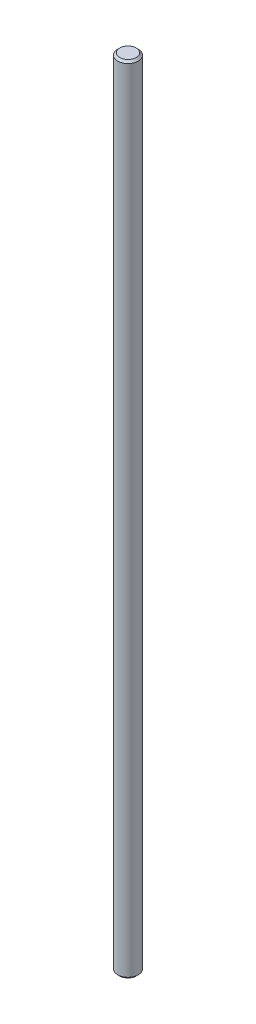
ISO-10303-21;
HEADER;
FILE_DESCRIPTION(('STEP AP214'),'2;1');
FILE_NAME('part.step','',(''),(''),'','','');
FILE_SCHEMA(('AUTOMOTIVE_DESIGN { 1 0 10303 214 1 1 1 1 }'));
ENDSEC;
DATA;
#1=APPLICATION_CONTEXT('core data for automotive mechanical design processes');
#2=APPLICATION_PROTOCOL_DEFINITION('international standard','automotive_design',2000,#1);
#3=PRODUCT_CONTEXT('',#1,'mechanical');
#4=PRODUCT('Part','Part','',(#3));
#5=PRODUCT_RELATED_PRODUCT_CATEGORY('part','',(#4));
#6=PRODUCT_DEFINITION_FORMATION('','',#4);
#7=PRODUCT_DEFINITION_CONTEXT('part definition',#1,'design');
#8=PRODUCT_DEFINITION('design','',#6,#7);
#9=PRODUCT_DEFINITION_SHAPE('','',#8);
#10=(LENGTH_UNIT() NAMED_UNIT(*) SI_UNIT(.MILLI.,.METRE.));
#11=(NAMED_UNIT(*) PLANE_ANGLE_UNIT() SI_UNIT($,.RADIAN.));
#12=(NAMED_UNIT(*) SI_UNIT($,.STERADIAN.) SOLID_ANGLE_UNIT());
#13=UNCERTAINTY_MEASURE_WITH_UNIT(LENGTH_MEASURE(1.E-05),#10,'distance_accuracy_value','');
#14=(GEOMETRIC_REPRESENTATION_CONTEXT(3) GLOBAL_UNCERTAINTY_ASSIGNED_CONTEXT((#13)) GLOBAL_UNIT_ASSIGNED_CONTEXT((#10,
#11,#12)) REPRESENTATION_CONTEXT('',''));
#15=CARTESIAN_POINT('',(0.,0.,0.));
#16=DIRECTION('',(0.,0.,1.));
#17=DIRECTION('',(1.,0.,0.));
#18=AXIS2_PLACEMENT_3D('',#15,#16,#17);
#19=CARTESIAN_POINT('',(0.,192.5,0.));
#20=DIRECTION('',(0.,-1.,0.));
#21=DIRECTION('',(0.,0.,-1.));
#22=AXIS2_PLACEMENT_3D('',#19,#20,#21);
#23=CYLINDRICAL_SURFACE('',#22,5.);
#24=CARTESIAN_POINT('',(0.,-191.5,0.));
#25=DIRECTION('',(0.,1.,0.));
#26=DIRECTION('',(0.,0.,1.));
#27=AXIS2_PLACEMENT_3D('',#24,#25,#26);
#28=CIRCLE('',#27,5.);
#29=CARTESIAN_POINT('',(0.,-191.5,5.));
#30=VERTEX_POINT('',#29);
#31=EDGE_CURVE('E44',#30,#30,#28,.T.);
#32=ORIENTED_EDGE('',*,*,#31,.T.);
#33=EDGE_LOOP('',(#32));
#34=FACE_BOUND('',#33,.T.);
#35=CARTESIAN_POINT('',(0.,191.5,0.));
#36=DIRECTION('',(0.,1.,0.));
#37=DIRECTION('',(0.,0.,1.));
#38=AXIS2_PLACEMENT_3D('',#35,#36,#37);
#39=CIRCLE('',#38,5.);
#40=CARTESIAN_POINT('',(0.,191.5,5.));
#41=VERTEX_POINT('',#40);
#42=EDGE_CURVE('E48',#41,#41,#39,.F.);
#43=ORIENTED_EDGE('',*,*,#42,.T.);
#44=EDGE_LOOP('',(#43));
#45=FACE_BOUND('',#44,.T.);
#46=ADVANCED_FACE('F33',(#34,#45),#23,.T.);
#47=CARTESIAN_POINT('',(0.,192.5,0.));
#48=DIRECTION('',(0.,1.,0.));
#49=DIRECTION('',(0.,0.,1.));
#50=AXIS2_PLACEMENT_3D('',#47,#48,#49);
#51=PLANE('',#50);
#52=CARTESIAN_POINT('',(0.,192.5,0.));
#53=DIRECTION('',(0.,1.,0.));
#54=DIRECTION('',(0.,0.,1.));
#55=AXIS2_PLACEMENT_3D('',#52,#53,#54);
#56=CIRCLE('',#55,4.);
#57=CARTESIAN_POINT('',(0.,192.5,4.));
#58=VERTEX_POINT('',#57);
#59=EDGE_CURVE('E10',#58,#58,#56,.T.);
#60=ORIENTED_EDGE('',*,*,#59,.T.);
#61=EDGE_LOOP('',(#60));
#62=FACE_BOUND('',#61,.T.);
#63=ADVANCED_FACE('F64',(#62),#51,.T.);
#64=CARTESIAN_POINT('',(0.,-192.5,0.));
#65=DIRECTION('',(0.,1.,0.));
#66=DIRECTION('',(0.,0.,1.));
#67=AXIS2_PLACEMENT_3D('',#64,#65,#66);
#68=PLANE('',#67);
#69=CARTESIAN_POINT('',(0.,-192.5,0.));
#70=DIRECTION('',(0.,1.,0.));
#71=DIRECTION('',(0.,0.,1.));
#72=AXIS2_PLACEMENT_3D('',#69,#70,#71);
#73=CIRCLE('',#72,4.00000000000006);
#74=CARTESIAN_POINT('',(0.,-192.5,4.00000000000006));
#75=VERTEX_POINT('',#74);
#76=EDGE_CURVE('E40',#75,#75,#73,.F.);
#77=ORIENTED_EDGE('',*,*,#76,.T.);
#78=EDGE_LOOP('',(#77));
#79=FACE_BOUND('',#78,.T.);
#80=ADVANCED_FACE('F61',(#79),#68,.F.);
#81=CARTESIAN_POINT('',(0.,-191.5,0.));
#82=DIRECTION('',(0.,1.,0.));
#83=DIRECTION('',(0.,0.,1.));
#84=AXIS2_PLACEMENT_3D('',#81,#82,#83);
#85=CONICAL_SURFACE('',#84,5.,0.785398163397446);
#86=ORIENTED_EDGE('',*,*,#76,.F.);
#87=EDGE_LOOP('',(#86));
#88=FACE_BOUND('',#87,.T.);
#89=ORIENTED_EDGE('',*,*,#31,.F.);
#90=EDGE_LOOP('',(#89));
#91=FACE_BOUND('',#90,.T.);
#92=ADVANCED_FACE('F57',(#88,#91),#85,.T.);
#93=CARTESIAN_POINT('',(0.,192.5,0.));
#94=DIRECTION('',(0.,-1.,0.));
#95=DIRECTION('',(0.,0.,-1.));
#96=AXIS2_PLACEMENT_3D('',#93,#94,#95);
#97=CONICAL_SURFACE('',#96,4.,0.785398163397446);
#98=ORIENTED_EDGE('',*,*,#42,.F.);
#99=EDGE_LOOP('',(#98));
#100=FACE_BOUND('',#99,.T.);
#101=ORIENTED_EDGE('',*,*,#59,.F.);
#102=EDGE_LOOP('',(#101));
#103=FACE_BOUND('',#102,.T.);
#104=ADVANCED_FACE('F35',(#100,#103),#97,.T.);
#105=CLOSED_SHELL('',(#46,#63,#80,#92,#104));
#106=MANIFOLD_SOLID_BREP('B2',#105);
#107=ADVANCED_BREP_SHAPE_REPRESENTATION('',(#18,#106),#14);
#108=SHAPE_DEFINITION_REPRESENTATION(#9,#107);
ENDSEC;
END-ISO-10303-21;
